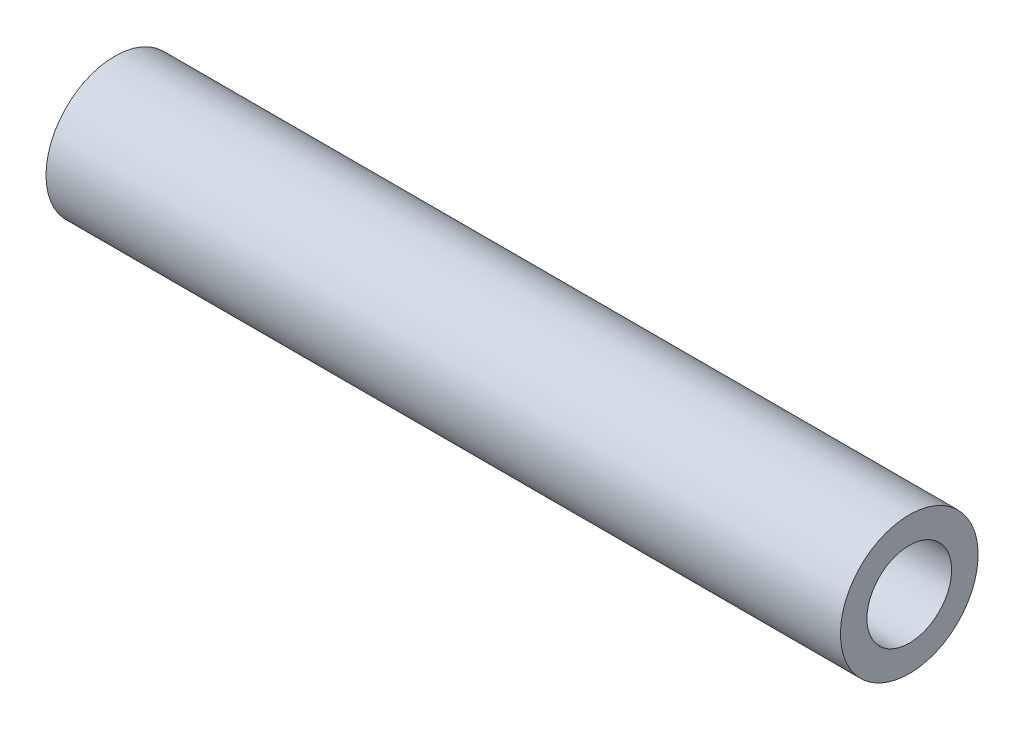
ISO-10303-21;
HEADER;
FILE_DESCRIPTION(('STEP AP214'),'2;1');
FILE_NAME('part.step','',(''),(''),'','','');
FILE_SCHEMA(('AUTOMOTIVE_DESIGN { 1 0 10303 214 1 1 1 1 }'));
ENDSEC;
DATA;
#1=APPLICATION_CONTEXT('core data for automotive mechanical design processes');
#2=APPLICATION_PROTOCOL_DEFINITION('international standard','automotive_design',2000,#1);
#3=PRODUCT_CONTEXT('',#1,'mechanical');
#4=PRODUCT('Part','Part','',(#3));
#5=PRODUCT_RELATED_PRODUCT_CATEGORY('part','',(#4));
#6=PRODUCT_DEFINITION_FORMATION('','',#4);
#7=PRODUCT_DEFINITION_CONTEXT('part definition',#1,'design');
#8=PRODUCT_DEFINITION('design','',#6,#7);
#9=PRODUCT_DEFINITION_SHAPE('','',#8);
#10=(LENGTH_UNIT() NAMED_UNIT(*) SI_UNIT(.MILLI.,.METRE.));
#11=(NAMED_UNIT(*) PLANE_ANGLE_UNIT() SI_UNIT($,.RADIAN.));
#12=(NAMED_UNIT(*) SI_UNIT($,.STERADIAN.) SOLID_ANGLE_UNIT());
#13=UNCERTAINTY_MEASURE_WITH_UNIT(LENGTH_MEASURE(1.E-05),#10,'distance_accuracy_value','');
#14=(GEOMETRIC_REPRESENTATION_CONTEXT(3) GLOBAL_UNCERTAINTY_ASSIGNED_CONTEXT((#13)) GLOBAL_UNIT_ASSIGNED_CONTEXT((#10,
#11,#12)) REPRESENTATION_CONTEXT('',''));
#15=CARTESIAN_POINT('',(0.,0.,0.));
#16=DIRECTION('',(0.,0.,1.));
#17=DIRECTION('',(1.,0.,0.));
#18=AXIS2_PLACEMENT_3D('',#15,#16,#17);
#19=CARTESIAN_POINT('',(-75.,8.,0.));
#20=DIRECTION('',(1.,0.,0.));
#21=DIRECTION('',(0.,0.,-1.));
#22=AXIS2_PLACEMENT_3D('',#19,#20,#21);
#23=PLANE('',#22);
#24=CARTESIAN_POINT('',(-75.,0.,0.));
#25=DIRECTION('',(-1.,0.,0.));
#26=DIRECTION('',(0.,0.,1.));
#27=AXIS2_PLACEMENT_3D('',#24,#25,#26);
#28=CIRCLE('',#27,8.);
#29=CARTESIAN_POINT('',(-75.,0.,8.));
#30=VERTEX_POINT('',#29);
#31=EDGE_CURVE('E47',#30,#30,#28,.T.);
#32=ORIENTED_EDGE('',*,*,#31,.F.);
#33=EDGE_LOOP('',(#32));
#34=FACE_BOUND('',#33,.T.);
#35=CARTESIAN_POINT('',(-75.,0.,0.));
#36=DIRECTION('',(-1.,0.,0.));
#37=DIRECTION('',(0.,0.,1.));
#38=AXIS2_PLACEMENT_3D('',#35,#36,#37);
#39=CIRCLE('',#38,13.);
#40=CARTESIAN_POINT('',(-75.,0.,13.));
#41=VERTEX_POINT('',#40);
#42=EDGE_CURVE('E10',#41,#41,#39,.T.);
#43=ORIENTED_EDGE('',*,*,#42,.T.);
#44=EDGE_LOOP('',(#43));
#45=FACE_BOUND('',#44,.T.);
#46=ADVANCED_FACE('F34',(#34,#45),#23,.F.);
#47=CARTESIAN_POINT('',(-101.395540412834,0.,0.));
#48=DIRECTION('',(-1.,0.,0.));
#49=DIRECTION('',(0.,0.,1.));
#50=AXIS2_PLACEMENT_3D('',#47,#48,#49);
#51=CYLINDRICAL_SURFACE('',#50,13.);
#52=ORIENTED_EDGE('',*,*,#42,.F.);
#53=EDGE_LOOP('',(#52));
#54=FACE_BOUND('',#53,.T.);
#55=CARTESIAN_POINT('',(75.,0.,0.));
#56=DIRECTION('',(-1.,0.,0.));
#57=DIRECTION('',(0.,0.,1.));
#58=AXIS2_PLACEMENT_3D('',#55,#56,#57);
#59=CIRCLE('',#58,13.);
#60=CARTESIAN_POINT('',(75.,0.,13.));
#61=VERTEX_POINT('',#60);
#62=EDGE_CURVE('E41',#61,#61,#59,.T.);
#63=ORIENTED_EDGE('',*,*,#62,.T.);
#64=EDGE_LOOP('',(#63));
#65=FACE_BOUND('',#64,.T.);
#66=ADVANCED_FACE('F59',(#54,#65),#51,.T.);
#67=CARTESIAN_POINT('',(75.,13.,0.));
#68=DIRECTION('',(-1.,0.,0.));
#69=DIRECTION('',(0.,0.,1.));
#70=AXIS2_PLACEMENT_3D('',#67,#68,#69);
#71=PLANE('',#70);
#72=ORIENTED_EDGE('',*,*,#62,.F.);
#73=EDGE_LOOP('',(#72));
#74=FACE_BOUND('',#73,.T.);
#75=CARTESIAN_POINT('',(75.,0.,0.));
#76=DIRECTION('',(-1.,0.,0.));
#77=DIRECTION('',(0.,0.,1.));
#78=AXIS2_PLACEMENT_3D('',#75,#76,#77);
#79=CIRCLE('',#78,8.);
#80=CARTESIAN_POINT('',(75.,0.,8.));
#81=VERTEX_POINT('',#80);
#82=EDGE_CURVE('E44',#81,#81,#79,.T.);
#83=ORIENTED_EDGE('',*,*,#82,.T.);
#84=EDGE_LOOP('',(#83));
#85=FACE_BOUND('',#84,.T.);
#86=ADVANCED_FACE('F65',(#74,#85),#71,.F.);
#87=CARTESIAN_POINT('',(-101.395540412834,0.,0.));
#88=DIRECTION('',(-1.,0.,0.));
#89=DIRECTION('',(0.,0.,1.));
#90=AXIS2_PLACEMENT_3D('',#87,#88,#89);
#91=CYLINDRICAL_SURFACE('',#90,8.);
#92=ORIENTED_EDGE('',*,*,#82,.F.);
#93=EDGE_LOOP('',(#92));
#94=FACE_BOUND('',#93,.T.);
#95=ORIENTED_EDGE('',*,*,#31,.T.);
#96=EDGE_LOOP('',(#95));
#97=FACE_BOUND('',#96,.T.);
#98=ADVANCED_FACE('F54',(#94,#97),#91,.F.);
#99=CLOSED_SHELL('',(#46,#66,#86,#98));
#100=MANIFOLD_SOLID_BREP('B2',#99);
#101=ADVANCED_BREP_SHAPE_REPRESENTATION('',(#18,#100),#14);
#102=SHAPE_DEFINITION_REPRESENTATION(#9,#101);
ENDSEC;
END-ISO-10303-21;
